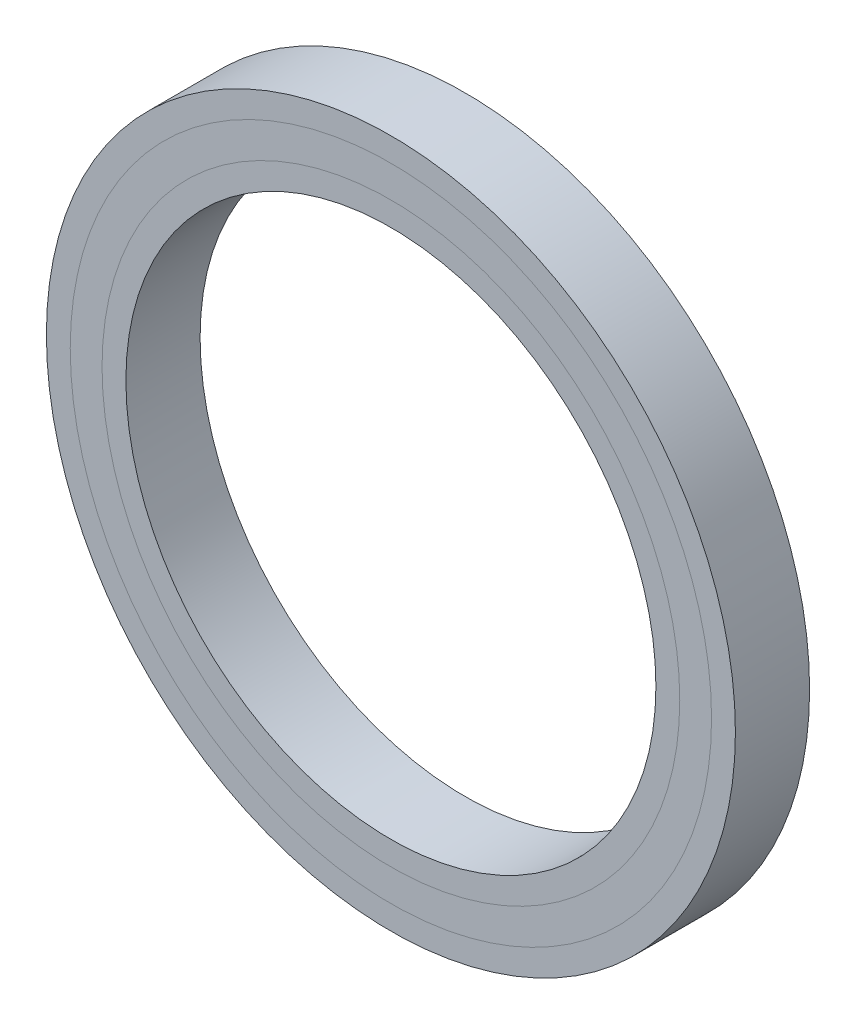
ISO-10303-21;
HEADER;
FILE_DESCRIPTION(('STEP AP214'),'2;1');
FILE_NAME('part.step','',(''),(''),'','','');
FILE_SCHEMA(('AUTOMOTIVE_DESIGN { 1 0 10303 214 1 1 1 1 }'));
ENDSEC;
DATA;
#1=APPLICATION_CONTEXT('core data for automotive mechanical design processes');
#2=APPLICATION_PROTOCOL_DEFINITION('international standard','automotive_design',2000,#1);
#3=PRODUCT_CONTEXT('',#1,'mechanical');
#4=PRODUCT('Part','Part','',(#3));
#5=PRODUCT_RELATED_PRODUCT_CATEGORY('part','',(#4));
#6=PRODUCT_DEFINITION_FORMATION('','',#4);
#7=PRODUCT_DEFINITION_CONTEXT('part definition',#1,'design');
#8=PRODUCT_DEFINITION('design','',#6,#7);
#9=PRODUCT_DEFINITION_SHAPE('','',#8);
#10=(LENGTH_UNIT() NAMED_UNIT(*) SI_UNIT(.MILLI.,.METRE.));
#11=(NAMED_UNIT(*) PLANE_ANGLE_UNIT() SI_UNIT($,.RADIAN.));
#12=(NAMED_UNIT(*) SI_UNIT($,.STERADIAN.) SOLID_ANGLE_UNIT());
#13=UNCERTAINTY_MEASURE_WITH_UNIT(LENGTH_MEASURE(1.E-05),#10,'distance_accuracy_value','');
#14=(GEOMETRIC_REPRESENTATION_CONTEXT(3) GLOBAL_UNCERTAINTY_ASSIGNED_CONTEXT((#13)) GLOBAL_UNIT_ASSIGNED_CONTEXT((#10,
#11,#12)) REPRESENTATION_CONTEXT('',''));
#15=CARTESIAN_POINT('',(0.,0.,0.));
#16=DIRECTION('',(0.,0.,1.));
#17=DIRECTION('',(1.,0.,0.));
#18=AXIS2_PLACEMENT_3D('',#15,#16,#17);
#19=CARTESIAN_POINT('',(0.,0.,7.));
#20=DIRECTION('',(0.,0.,1.));
#21=DIRECTION('',(1.,0.,0.));
#22=AXIS2_PLACEMENT_3D('',#19,#20,#21);
#23=PLANE('',#22);
#24=CARTESIAN_POINT('',(0.,0.,7.));
#25=DIRECTION('',(0.,0.,1.));
#26=DIRECTION('',(1.,0.,0.));
#27=AXIS2_PLACEMENT_3D('',#24,#25,#26);
#28=CIRCLE('',#27,32.5);
#29=CARTESIAN_POINT('',(32.5,0.,7.));
#30=VERTEX_POINT('',#29);
#31=EDGE_CURVE('E11',#30,#30,#28,.T.);
#32=ORIENTED_EDGE('',*,*,#31,.T.);
#33=EDGE_LOOP('',(#32));
#34=FACE_BOUND('',#33,.T.);
#35=CARTESIAN_POINT('',(0.,0.,7.));
#36=DIRECTION('',(0.,0.,1.));
#37=DIRECTION('',(1.,0.,0.));
#38=AXIS2_PLACEMENT_3D('',#35,#36,#37);
#39=CIRCLE('',#38,30.2499999999988);
#40=CARTESIAN_POINT('',(30.2499999999988,0.,7.));
#41=VERTEX_POINT('',#40);
#42=EDGE_CURVE('E53',#41,#41,#39,.T.);
#43=ORIENTED_EDGE('',*,*,#42,.F.);
#44=EDGE_LOOP('',(#43));
#45=FACE_BOUND('',#44,.T.);
#46=ADVANCED_FACE('F42',(#34,#45),#23,.T.);
#47=CARTESIAN_POINT('',(0.,0.,0.));
#48=DIRECTION('',(0.,0.,1.));
#49=DIRECTION('',(1.,0.,0.));
#50=AXIS2_PLACEMENT_3D('',#47,#48,#49);
#51=PLANE('',#50);
#52=CARTESIAN_POINT('',(0.,0.,0.));
#53=DIRECTION('',(0.,0.,1.));
#54=DIRECTION('',(1.,0.,0.));
#55=AXIS2_PLACEMENT_3D('',#52,#53,#54);
#56=CIRCLE('',#55,32.5);
#57=CARTESIAN_POINT('',(32.5,0.,0.));
#58=VERTEX_POINT('',#57);
#59=EDGE_CURVE('E46',#58,#58,#56,.T.);
#60=ORIENTED_EDGE('',*,*,#59,.F.);
#61=EDGE_LOOP('',(#60));
#62=FACE_BOUND('',#61,.T.);
#63=CARTESIAN_POINT('',(0.,0.,0.));
#64=DIRECTION('',(0.,0.,1.));
#65=DIRECTION('',(1.,0.,0.));
#66=AXIS2_PLACEMENT_3D('',#63,#64,#65);
#67=CIRCLE('',#66,30.2499999999988);
#68=CARTESIAN_POINT('',(30.2499999999988,0.,0.));
#69=VERTEX_POINT('',#68);
#70=EDGE_CURVE('E55',#69,#69,#67,.T.);
#71=ORIENTED_EDGE('',*,*,#70,.T.);
#72=EDGE_LOOP('',(#71));
#73=FACE_BOUND('',#72,.T.);
#74=ADVANCED_FACE('F65',(#62,#73),#51,.F.);
#75=CARTESIAN_POINT('',(0.,0.,7.));
#76=DIRECTION('',(0.,0.,-1.));
#77=DIRECTION('',(-1.,0.,0.));
#78=AXIS2_PLACEMENT_3D('',#75,#76,#77);
#79=CYLINDRICAL_SURFACE('',#78,32.5);
#80=ORIENTED_EDGE('',*,*,#31,.F.);
#81=EDGE_LOOP('',(#80));
#82=FACE_BOUND('',#81,.T.);
#83=ORIENTED_EDGE('',*,*,#59,.T.);
#84=EDGE_LOOP('',(#83));
#85=FACE_BOUND('',#84,.T.);
#86=ADVANCED_FACE('F44',(#82,#85),#79,.T.);
#87=CARTESIAN_POINT('',(0.,0.,7.));
#88=DIRECTION('',(0.,0.,-1.));
#89=DIRECTION('',(-1.,0.,0.));
#90=AXIS2_PLACEMENT_3D('',#87,#88,#89);
#91=CYLINDRICAL_SURFACE('',#90,30.2499999999988);
#92=ORIENTED_EDGE('',*,*,#42,.T.);
#93=EDGE_LOOP('',(#92));
#94=FACE_BOUND('',#93,.T.);
#95=ORIENTED_EDGE('',*,*,#70,.F.);
#96=EDGE_LOOP('',(#95));
#97=FACE_BOUND('',#96,.T.);
#98=ADVANCED_FACE('F61',(#94,#97),#91,.F.);
#99=CLOSED_SHELL('',(#46,#74,#86,#98));
#100=MANIFOLD_SOLID_BREP('B2',#99);
#101=CARTESIAN_POINT('',(0.,0.,7.));
#102=DIRECTION('',(0.,0.,1.));
#103=DIRECTION('',(1.,0.,0.));
#104=AXIS2_PLACEMENT_3D('',#101,#102,#103);
#105=PLANE('',#104);
#106=CARTESIAN_POINT('',(0.,0.,7.));
#107=DIRECTION('',(0.,0.,1.));
#108=DIRECTION('',(1.,0.,0.));
#109=AXIS2_PLACEMENT_3D('',#106,#107,#108);
#110=CIRCLE('',#109,30.25);
#111=CARTESIAN_POINT('',(30.25,0.,7.));
#112=VERTEX_POINT('',#111);
#113=EDGE_CURVE('E41',#112,#112,#110,.T.);
#114=ORIENTED_EDGE('',*,*,#113,.T.);
#115=EDGE_LOOP('',(#114));
#116=FACE_BOUND('',#115,.T.);
#117=CARTESIAN_POINT('',(0.,0.,7.));
#118=DIRECTION('',(0.,0.,1.));
#119=DIRECTION('',(1.,0.,0.));
#120=AXIS2_PLACEMENT_3D('',#117,#118,#119);
#121=CIRCLE('',#120,27.25);
#122=CARTESIAN_POINT('',(27.25,0.,7.));
#123=VERTEX_POINT('',#122);
#124=EDGE_CURVE('E124',#123,#123,#121,.T.);
#125=ORIENTED_EDGE('',*,*,#124,.F.);
#126=EDGE_LOOP('',(#125));
#127=FACE_BOUND('',#126,.T.);
#128=ADVANCED_FACE('F113',(#116,#127),#105,.T.);
#129=CARTESIAN_POINT('',(0.,0.,0.));
#130=DIRECTION('',(0.,0.,1.));
#131=DIRECTION('',(1.,0.,0.));
#132=AXIS2_PLACEMENT_3D('',#129,#130,#131);
#133=PLANE('',#132);
#134=CARTESIAN_POINT('',(0.,0.,0.));
#135=DIRECTION('',(0.,0.,1.));
#136=DIRECTION('',(1.,0.,0.));
#137=AXIS2_PLACEMENT_3D('',#134,#135,#136);
#138=CIRCLE('',#137,30.25);
#139=CARTESIAN_POINT('',(30.25,0.,0.));
#140=VERTEX_POINT('',#139);
#141=EDGE_CURVE('E117',#140,#140,#138,.T.);
#142=ORIENTED_EDGE('',*,*,#141,.F.);
#143=EDGE_LOOP('',(#142));
#144=FACE_BOUND('',#143,.T.);
#145=CARTESIAN_POINT('',(0.,0.,0.));
#146=DIRECTION('',(0.,0.,1.));
#147=DIRECTION('',(1.,0.,0.));
#148=AXIS2_PLACEMENT_3D('',#145,#146,#147);
#149=CIRCLE('',#148,27.25);
#150=CARTESIAN_POINT('',(27.25,0.,0.));
#151=VERTEX_POINT('',#150);
#152=EDGE_CURVE('E126',#151,#151,#149,.T.);
#153=ORIENTED_EDGE('',*,*,#152,.T.);
#154=EDGE_LOOP('',(#153));
#155=FACE_BOUND('',#154,.T.);
#156=ADVANCED_FACE('F136',(#144,#155),#133,.F.);
#157=CARTESIAN_POINT('',(0.,0.,7.));
#158=DIRECTION('',(0.,0.,-1.));
#159=DIRECTION('',(-1.,0.,0.));
#160=AXIS2_PLACEMENT_3D('',#157,#158,#159);
#161=CYLINDRICAL_SURFACE('',#160,30.25);
#162=ORIENTED_EDGE('',*,*,#113,.F.);
#163=EDGE_LOOP('',(#162));
#164=FACE_BOUND('',#163,.T.);
#165=ORIENTED_EDGE('',*,*,#141,.T.);
#166=EDGE_LOOP('',(#165));
#167=FACE_BOUND('',#166,.T.);
#168=ADVANCED_FACE('F115',(#164,#167),#161,.T.);
#169=CARTESIAN_POINT('',(0.,0.,7.));
#170=DIRECTION('',(0.,0.,-1.));
#171=DIRECTION('',(-1.,0.,0.));
#172=AXIS2_PLACEMENT_3D('',#169,#170,#171);
#173=CYLINDRICAL_SURFACE('',#172,27.25);
#174=ORIENTED_EDGE('',*,*,#124,.T.);
#175=EDGE_LOOP('',(#174));
#176=FACE_BOUND('',#175,.T.);
#177=ORIENTED_EDGE('',*,*,#152,.F.);
#178=EDGE_LOOP('',(#177));
#179=FACE_BOUND('',#178,.T.);
#180=ADVANCED_FACE('F132',(#176,#179),#173,.F.);
#181=CLOSED_SHELL('',(#128,#156,#168,#180));
#182=MANIFOLD_SOLID_BREP('B6',#181);
#183=CARTESIAN_POINT('',(0.,0.,7.));
#184=DIRECTION('',(0.,0.,1.));
#185=DIRECTION('',(1.,0.,0.));
#186=AXIS2_PLACEMENT_3D('',#183,#184,#185);
#187=PLANE('',#186);
#188=CARTESIAN_POINT('',(0.,0.,7.));
#189=DIRECTION('',(0.,0.,1.));
#190=DIRECTION('',(1.,0.,0.));
#191=AXIS2_PLACEMENT_3D('',#188,#189,#190);
#192=CIRCLE('',#191,27.2499999999987);
#193=CARTESIAN_POINT('',(27.2499999999987,0.,7.));
#194=VERTEX_POINT('',#193);
#195=EDGE_CURVE('E112',#194,#194,#192,.T.);
#196=ORIENTED_EDGE('',*,*,#195,.T.);
#197=EDGE_LOOP('',(#196));
#198=FACE_BOUND('',#197,.T.);
#199=CARTESIAN_POINT('',(0.,0.,7.));
#200=DIRECTION('',(0.,0.,1.));
#201=DIRECTION('',(1.,0.,0.));
#202=AXIS2_PLACEMENT_3D('',#199,#200,#201);
#203=CIRCLE('',#202,25.);
#204=CARTESIAN_POINT('',(25.,0.,7.));
#205=VERTEX_POINT('',#204);
#206=EDGE_CURVE('E190',#205,#205,#203,.T.);
#207=ORIENTED_EDGE('',*,*,#206,.F.);
#208=EDGE_LOOP('',(#207));
#209=FACE_BOUND('',#208,.T.);
#210=ADVANCED_FACE('F179',(#198,#209),#187,.T.);
#211=CARTESIAN_POINT('',(0.,0.,0.));
#212=DIRECTION('',(0.,0.,1.));
#213=DIRECTION('',(1.,0.,0.));
#214=AXIS2_PLACEMENT_3D('',#211,#212,#213);
#215=PLANE('',#214);
#216=CARTESIAN_POINT('',(0.,0.,0.));
#217=DIRECTION('',(0.,0.,1.));
#218=DIRECTION('',(1.,0.,0.));
#219=AXIS2_PLACEMENT_3D('',#216,#217,#218);
#220=CIRCLE('',#219,27.2499999999987);
#221=CARTESIAN_POINT('',(27.2499999999987,0.,0.));
#222=VERTEX_POINT('',#221);
#223=EDGE_CURVE('E183',#222,#222,#220,.T.);
#224=ORIENTED_EDGE('',*,*,#223,.F.);
#225=EDGE_LOOP('',(#224));
#226=FACE_BOUND('',#225,.T.);
#227=CARTESIAN_POINT('',(0.,0.,0.));
#228=DIRECTION('',(0.,0.,1.));
#229=DIRECTION('',(1.,0.,0.));
#230=AXIS2_PLACEMENT_3D('',#227,#228,#229);
#231=CIRCLE('',#230,25.);
#232=CARTESIAN_POINT('',(25.,0.,0.));
#233=VERTEX_POINT('',#232);
#234=EDGE_CURVE('E192',#233,#233,#231,.T.);
#235=ORIENTED_EDGE('',*,*,#234,.T.);
#236=EDGE_LOOP('',(#235));
#237=FACE_BOUND('',#236,.T.);
#238=ADVANCED_FACE('F202',(#226,#237),#215,.F.);
#239=CARTESIAN_POINT('',(0.,0.,7.));
#240=DIRECTION('',(0.,0.,-1.));
#241=DIRECTION('',(-1.,0.,0.));
#242=AXIS2_PLACEMENT_3D('',#239,#240,#241);
#243=CYLINDRICAL_SURFACE('',#242,27.2499999999987);
#244=ORIENTED_EDGE('',*,*,#195,.F.);
#245=EDGE_LOOP('',(#244));
#246=FACE_BOUND('',#245,.T.);
#247=ORIENTED_EDGE('',*,*,#223,.T.);
#248=EDGE_LOOP('',(#247));
#249=FACE_BOUND('',#248,.T.);
#250=ADVANCED_FACE('F181',(#246,#249),#243,.T.);
#251=CARTESIAN_POINT('',(0.,0.,7.));
#252=DIRECTION('',(0.,0.,-1.));
#253=DIRECTION('',(-1.,0.,0.));
#254=AXIS2_PLACEMENT_3D('',#251,#252,#253);
#255=CYLINDRICAL_SURFACE('',#254,25.);
#256=ORIENTED_EDGE('',*,*,#206,.T.);
#257=EDGE_LOOP('',(#256));
#258=FACE_BOUND('',#257,.T.);
#259=ORIENTED_EDGE('',*,*,#234,.F.);
#260=EDGE_LOOP('',(#259));
#261=FACE_BOUND('',#260,.T.);
#262=ADVANCED_FACE('F198',(#258,#261),#255,.F.);
#263=CLOSED_SHELL('',(#210,#238,#250,#262));
#264=MANIFOLD_SOLID_BREP('B36',#263);
#265=ADVANCED_BREP_SHAPE_REPRESENTATION('',(#18,#100,#182,#264),#14);
#266=SHAPE_DEFINITION_REPRESENTATION(#9,#265);
ENDSEC;
END-ISO-10303-21;
